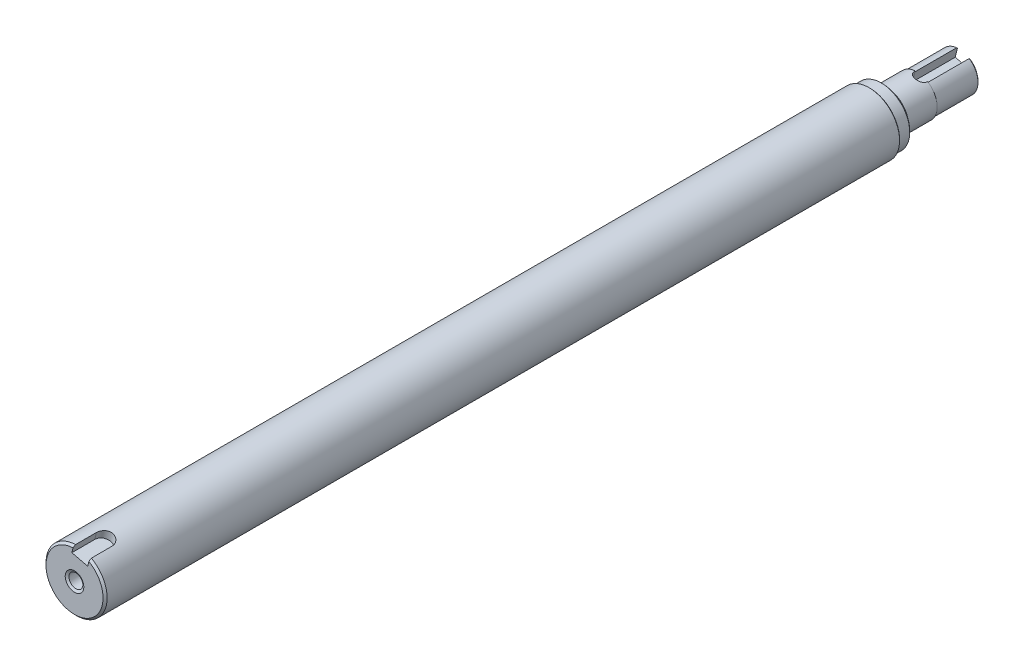
ISO-10303-21;
HEADER;
FILE_DESCRIPTION(('STEP AP214'),'2;1');
FILE_NAME('part.step','',(''),(''),'','','');
FILE_SCHEMA(('AUTOMOTIVE_DESIGN { 1 0 10303 214 1 1 1 1 }'));
ENDSEC;
DATA;
#1=APPLICATION_CONTEXT('core data for automotive mechanical design processes');
#2=APPLICATION_PROTOCOL_DEFINITION('international standard','automotive_design',2000,#1);
#3=PRODUCT_CONTEXT('',#1,'mechanical');
#4=PRODUCT('Part','Part','',(#3));
#5=PRODUCT_RELATED_PRODUCT_CATEGORY('part','',(#4));
#6=PRODUCT_DEFINITION_FORMATION('','',#4);
#7=PRODUCT_DEFINITION_CONTEXT('part definition',#1,'design');
#8=PRODUCT_DEFINITION('design','',#6,#7);
#9=PRODUCT_DEFINITION_SHAPE('','',#8);
#10=(LENGTH_UNIT() NAMED_UNIT(*) SI_UNIT(.MILLI.,.METRE.));
#11=(NAMED_UNIT(*) PLANE_ANGLE_UNIT() SI_UNIT($,.RADIAN.));
#12=(NAMED_UNIT(*) SI_UNIT($,.STERADIAN.) SOLID_ANGLE_UNIT());
#13=UNCERTAINTY_MEASURE_WITH_UNIT(LENGTH_MEASURE(1.E-05),#10,'distance_accuracy_value','');
#14=(GEOMETRIC_REPRESENTATION_CONTEXT(3) GLOBAL_UNCERTAINTY_ASSIGNED_CONTEXT((#13)) GLOBAL_UNIT_ASSIGNED_CONTEXT((#10,
#11,#12)) REPRESENTATION_CONTEXT('',''));
#15=CARTESIAN_POINT('',(0.,0.,0.));
#16=DIRECTION('',(0.,0.,1.));
#17=DIRECTION('',(1.,0.,0.));
#18=AXIS2_PLACEMENT_3D('',#15,#16,#17);
#19=CARTESIAN_POINT('',(521.923120033733,395.355248277508,-133.35));
#20=DIRECTION('',(0.,0.,1.));
#21=DIRECTION('',(1.,0.,0.));
#22=AXIS2_PLACEMENT_3D('',#19,#20,#21);
#23=PLANE('',#22);
#24=DIRECTION('',(0.234780935456974,0.972048307619507,0.));
#25=VECTOR('',#24,1.);
#26=CARTESIAN_POINT('',(475.654817898661,414.490816223619,-133.35));
#27=LINE('',#26,#25);
#28=CARTESIAN_POINT('',(474.350316326028,409.089872814408,-133.35));
#29=VERTEX_POINT('',#28);
#30=CARTESIAN_POINT('',(475.401574776672,413.442330120322,-133.350000000001));
#31=VERTEX_POINT('',#30);
#32=EDGE_CURVE('E86',#29,#31,#27,.T.);
#33=ORIENTED_EDGE('',*,*,#32,.F.);
#34=DIRECTION('',(-0.972048307619508,0.234780935456973,0.));
#35=VECTOR('',#34,1.);
#36=CARTESIAN_POINT('',(475.121879670201,408.903515446889,-133.35));
#37=LINE('',#36,#35);
#38=CARTESIAN_POINT('',(480.522823079412,407.599013874256,-133.35));
#39=VERTEX_POINT('',#38);
#40=EDGE_CURVE('E163',#39,#29,#37,.T.);
#41=ORIENTED_EDGE('',*,*,#40,.F.);
#42=DIRECTION('',(-0.234780935456974,-0.972048307619507,0.));
#43=VECTOR('',#42,1.);
#44=CARTESIAN_POINT('',(481.268252549488,410.685267250948,-133.35));
#45=LINE('',#44,#43);
#46=CARTESIAN_POINT('',(481.574081530056,411.951471180169,-133.350000000002));
#47=VERTEX_POINT('',#46);
#48=EDGE_CURVE('E156',#47,#39,#45,.T.);
#49=ORIENTED_EDGE('',*,*,#48,.F.);
#50=CARTESIAN_POINT('',(476.510652388512,404.510927831157,-133.350000000005));
#51=DIRECTION('',(0.,0.,1.));
#52=DIRECTION('',(1.,0.,0.));
#53=AXIS2_PLACEMENT_3D('',#50,#51,#52);
#54=CIRCLE('',#53,8.99999999999548);
#55=EDGE_CURVE('E20',#31,#47,#54,.T.);
#56=ORIENTED_EDGE('',*,*,#55,.F.);
#57=EDGE_LOOP('',(#33,#41,#49,#56));
#58=FACE_BOUND('',#57,.T.);
#59=ADVANCED_FACE('F17',(#58),#23,.F.);
#60=CARTESIAN_POINT('',(476.510652388512,404.510927831157,-132.85));
#61=DIRECTION('',(0.,0.,1.));
#62=DIRECTION('',(1.,0.,0.));
#63=AXIS2_PLACEMENT_3D('',#60,#61,#62);
#64=CONICAL_SURFACE('',#63,9.50000000000045,0.785398163397421);
#65=CARTESIAN_POINT('',(476.510652388512,404.510927831157,-132.85));
#66=DIRECTION('',(0.,0.,-1.));
#67=DIRECTION('',(-1.,0.,0.));
#68=AXIS2_PLACEMENT_3D('',#65,#66,#67);
#69=CIRCLE('',#68,9.5);
#70=CARTESIAN_POINT('',(475.526565350604,413.959820501826,-132.85));
#71=VERTEX_POINT('',#70);
#72=CARTESIAN_POINT('',(481.699072103988,412.468961561675,-132.85));
#73=VERTEX_POINT('',#72);
#74=EDGE_CURVE('E149',#71,#73,#69,.F.);
#75=ORIENTED_EDGE('',*,*,#74,.F.);
#76=CARTESIAN_POINT('',(475.401574776673,413.442330120325,-133.349999999998));
#77=CARTESIAN_POINT('',(475.422441813003,413.528724559936,-133.266826631975));
#78=CARTESIAN_POINT('',(475.443291212558,413.615045979145,-133.183573280381));
#79=CARTESIAN_POINT('',(475.4849547372,413.787542772972,-133.016906613708));
#80=CARTESIAN_POINT('',(475.505768862289,413.873718147596,-132.933493298636));
#81=CARTESIAN_POINT('',(475.526565350605,413.959820501826,-132.85));
#82=B_SPLINE_CURVE_WITH_KNOTS('',3,(#76,#77,#78,#79,#80,#81),.UNSPECIFIED.,.F.,.F.,(4,2,4),(0.,
0.365177831816474,0.730355647592018),.UNSPECIFIED.);
#83=EDGE_CURVE('E170',#31,#71,#82,.T.);
#84=ORIENTED_EDGE('',*,*,#83,.F.);
#85=ORIENTED_EDGE('',*,*,#55,.T.);
#86=CARTESIAN_POINT('',(481.699072103989,412.468961561675,-132.85));
#87=CARTESIAN_POINT('',(481.678275615673,412.382859207444,-132.933493298637));
#88=CARTESIAN_POINT('',(481.657461490584,412.29668383282,-133.016906613708));
#89=CARTESIAN_POINT('',(481.615797965941,412.124187038991,-133.183573280382));
#90=CARTESIAN_POINT('',(481.594948566387,412.037865619782,-133.266826631978));
#91=CARTESIAN_POINT('',(481.574081530056,411.951471180171,-133.350000000001));
#92=B_SPLINE_CURVE_WITH_KNOTS('',3,(#86,#87,#88,#89,#90,#91),.UNSPECIFIED.,.F.,.F.,(4,2,4),(0.,
0.365177815777874,0.730355647596647),.UNSPECIFIED.);
#93=EDGE_CURVE('E162',#73,#47,#92,.T.);
#94=ORIENTED_EDGE('',*,*,#93,.F.);
#95=EDGE_LOOP('',(#75,#84,#85,#94));
#96=FACE_BOUND('',#95,.T.);
#97=ADVANCED_FACE('F303',(#96),#64,.T.);
#98=CARTESIAN_POINT('',(475.654817898661,414.490816223619,-133.35));
#99=DIRECTION('',(0.972048307619507,-0.234780935456974,0.));
#100=DIRECTION('',(0.234780935456974,0.972048307619507,0.));
#101=AXIS2_PLACEMENT_3D('',#98,#99,#100);
#102=PLANE('',#101);
#103=ORIENTED_EDGE('',*,*,#83,.T.);
#104=DIRECTION('',(0.,0.,-1.));
#105=VECTOR('',#104,1.);
#106=CARTESIAN_POINT('',(475.526565350604,413.959820501826,-133.35));
#107=LINE('',#106,#105);
#108=CARTESIAN_POINT('',(475.526565350604,413.959820501826,-112.35));
#109=VERTEX_POINT('',#108);
#110=EDGE_CURVE('E145',#109,#71,#107,.T.);
#111=ORIENTED_EDGE('',*,*,#110,.F.);
#112=DIRECTION('',(0.234780935456973,0.972048307619508,0.));
#113=VECTOR('',#112,1.);
#114=CARTESIAN_POINT('',(475.095745796104,412.1761261911,-112.35));
#115=LINE('',#114,#113);
#116=CARTESIAN_POINT('',(474.350316326028,409.089872814408,-112.35));
#117=VERTEX_POINT('',#116);
#118=EDGE_CURVE('E150',#109,#117,#115,.F.);
#119=ORIENTED_EDGE('',*,*,#118,.T.);
#120=DIRECTION('',(0.,0.,1.));
#121=VECTOR('',#120,1.);
#122=CARTESIAN_POINT('',(474.350316326028,409.089872814408,-133.35));
#123=LINE('',#122,#121);
#124=EDGE_CURVE('E159',#29,#117,#123,.T.);
#125=ORIENTED_EDGE('',*,*,#124,.F.);
#126=ORIENTED_EDGE('',*,*,#32,.T.);
#127=EDGE_LOOP('',(#103,#111,#119,#125,#126));
#128=FACE_BOUND('',#127,.T.);
#129=ADVANCED_FACE('F306',(#128),#102,.T.);
#130=CARTESIAN_POINT('',(475.121879670201,408.903515446889,-133.35));
#131=DIRECTION('',(0.234780935456973,0.972048307619508,0.));
#132=DIRECTION('',(-0.972048307619508,0.234780935456973,0.));
#133=AXIS2_PLACEMENT_3D('',#130,#131,#132);
#134=PLANE('',#133);
#135=ORIENTED_EDGE('',*,*,#124,.T.);
#136=CARTESIAN_POINT('',(477.43656970272,408.344443344332,-112.35));
#137=DIRECTION('',(0.234780935456973,0.972048307619508,0.));
#138=DIRECTION('',(-0.972048307619508,0.234780935456973,0.));
#139=AXIS2_PLACEMENT_3D('',#136,#137,#138);
#140=CIRCLE('',#139,3.17499999999991);
#141=CARTESIAN_POINT('',(480.522823079412,407.599013874256,-112.35));
#142=VERTEX_POINT('',#141);
#143=EDGE_CURVE('E152',#117,#142,#140,.T.);
#144=ORIENTED_EDGE('',*,*,#143,.T.);
#145=DIRECTION('',(0.,0.,1.));
#146=VECTOR('',#145,1.);
#147=CARTESIAN_POINT('',(480.522823079412,407.599013874256,-133.35));
#148=LINE('',#147,#146);
#149=EDGE_CURVE('E146',#39,#142,#148,.T.);
#150=ORIENTED_EDGE('',*,*,#149,.F.);
#151=ORIENTED_EDGE('',*,*,#40,.T.);
#152=EDGE_LOOP('',(#135,#144,#150,#151));
#153=FACE_BOUND('',#152,.T.);
#154=ADVANCED_FACE('F292',(#153),#134,.T.);
#155=CARTESIAN_POINT('',(481.268252549488,410.685267250948,-133.35));
#156=DIRECTION('',(-0.972048307619507,0.234780935456974,0.));
#157=DIRECTION('',(-0.234780935456974,-0.972048307619507,0.));
#158=AXIS2_PLACEMENT_3D('',#155,#156,#157);
#159=PLANE('',#158);
#160=ORIENTED_EDGE('',*,*,#48,.T.);
#161=ORIENTED_EDGE('',*,*,#149,.T.);
#162=DIRECTION('',(0.234780935456973,0.972048307619508,0.));
#163=VECTOR('',#162,1.);
#164=CARTESIAN_POINT('',(481.268252549488,410.685267250948,-112.35));
#165=LINE('',#164,#163);
#166=CARTESIAN_POINT('',(481.699072103988,412.468961561675,-112.35));
#167=VERTEX_POINT('',#166);
#168=EDGE_CURVE('E141',#142,#167,#165,.T.);
#169=ORIENTED_EDGE('',*,*,#168,.T.);
#170=DIRECTION('',(0.,0.,-1.));
#171=VECTOR('',#170,1.);
#172=CARTESIAN_POINT('',(481.699072103988,412.468961561675,-133.35));
#173=LINE('',#172,#171);
#174=EDGE_CURVE('E142',#73,#167,#173,.F.);
#175=ORIENTED_EDGE('',*,*,#174,.F.);
#176=ORIENTED_EDGE('',*,*,#93,.T.);
#177=EDGE_LOOP('',(#160,#161,#169,#175,#176));
#178=FACE_BOUND('',#177,.T.);
#179=ADVANCED_FACE('F287',(#178),#159,.T.);
#180=CARTESIAN_POINT('',(476.510652388512,404.510927831157,-133.35));
#181=DIRECTION('',(0.,0.,-1.));
#182=DIRECTION('',(-1.,0.,0.));
#183=AXIS2_PLACEMENT_3D('',#180,#181,#182);
#184=CYLINDRICAL_SURFACE('',#183,9.5);
#185=ORIENTED_EDGE('',*,*,#110,.T.);
#186=ORIENTED_EDGE('',*,*,#74,.T.);
#187=ORIENTED_EDGE('',*,*,#174,.T.);
#188=CARTESIAN_POINT('',(476.510652388512,404.510927831157,-112.35));
#189=DIRECTION('',(0.,0.,-1.));
#190=DIRECTION('',(-1.,0.,0.));
#191=AXIS2_PLACEMENT_3D('',#188,#189,#190);
#192=CIRCLE('',#191,9.5);
#193=EDGE_CURVE('E137',#109,#167,#192,.F.);
#194=ORIENTED_EDGE('',*,*,#193,.F.);
#195=EDGE_LOOP('',(#185,#186,#187,#194));
#196=FACE_BOUND('',#195,.T.);
#197=ADVANCED_FACE('F283',(#196),#184,.T.);
#198=CARTESIAN_POINT('',(478.181999172796,411.430696721024,-112.35));
#199=DIRECTION('',(0.234780935456973,0.972048307619508,0.));
#200=DIRECTION('',(-0.972048307619508,0.234780935456973,0.));
#201=AXIS2_PLACEMENT_3D('',#198,#199,#200);
#202=CYLINDRICAL_SURFACE('',#201,3.17499999999991);
#203=ORIENTED_EDGE('',*,*,#143,.F.);
#204=ORIENTED_EDGE('',*,*,#118,.F.);
#205=DIRECTION('',(-0.234780935458529,-0.972048307619132,0.));
#206=VECTOR('',#205,1.);
#207=CARTESIAN_POINT('',(475.644537989007,414.448254979187,-112.35));
#208=LINE('',#207,#206);
#209=CARTESIAN_POINT('',(475.644537989007,414.448254979187,-112.35));
#210=VERTEX_POINT('',#209);
#211=EDGE_CURVE('E134',#210,#109,#208,.T.);
#212=ORIENTED_EDGE('',*,*,#211,.F.);
#213=CARTESIAN_POINT('',(481.817044742391,412.957396039035,-112.35));
#214=CARTESIAN_POINT('',(481.817052534881,412.957380734605,-112.263137361035));
#215=CARTESIAN_POINT('',(481.813860906389,412.959395992926,-112.176282092153));
#216=CARTESIAN_POINT('',(481.801140539047,412.967372887523,-112.003240209029));
#217=CARTESIAN_POINT('',(481.791613376921,412.973333541907,-111.917053433817));
#218=CARTESIAN_POINT('',(481.766318526275,412.989064876514,-111.746194402301));
#219=CARTESIAN_POINT('',(481.75056811115,412.998825009725,-111.661518626264));
#220=CARTESIAN_POINT('',(481.712954282953,413.021930359429,-111.494056650198));
#221=CARTESIAN_POINT('',(481.691090677621,413.035275688677,-111.411270509686));
#222=CARTESIAN_POINT('',(481.616552953875,413.080281019562,-111.16667784466));
#223=CARTESIAN_POINT('',(481.554896723902,413.116933198912,-111.008400706112));
#224=CARTESIAN_POINT('',(481.409166513814,413.200703860779,-110.705578708409));
#225=CARTESIAN_POINT('',(481.32508030872,413.247828048496,-110.561041396297));
#226=CARTESIAN_POINT('',(481.1331658745,413.350905811269,-110.284623214537));
#227=CARTESIAN_POINT('',(481.024661524387,413.407094456569,-110.153298321329));
#228=CARTESIAN_POINT('',(480.787756454028,413.523385627714,-109.912038589056));
#229=CARTESIAN_POINT('',(480.659352286334,413.58348883067,-109.802107463708));
#230=CARTESIAN_POINT('',(480.381990484638,413.705317898208,-109.604260680395));
#231=CARTESIAN_POINT('',(480.232619919055,413.767048633857,-109.516924662349));
#232=CARTESIAN_POINT('',(479.919291083335,413.886955452596,-109.370574235725));
#233=CARTESIAN_POINT('',(479.755336961589,413.945132538654,-109.311551803507));
#234=CARTESIAN_POINT('',(479.422716740883,414.05294443559,-109.22537572021));
#235=CARTESIAN_POINT('',(479.254368340496,414.102792716884,-109.197264507543));
#236=CARTESIAN_POINT('',(478.913085026859,414.193908073176,-109.17067190051));
#237=CARTESIAN_POINT('',(478.740151110076,414.235176995579,-109.172184120599));
#238=CARTESIAN_POINT('',(478.401228550288,414.306604904744,-109.204172852332));
#239=CARTESIAN_POINT('',(478.235212942224,414.337108790361,-109.233610307922));
#240=CARTESIAN_POINT('',(477.908634124574,414.388863945628,-109.318904685825));
#241=CARTESIAN_POINT('',(477.748071211598,414.410114712682,-109.374763042886));
#242=CARTESIAN_POINT('',(477.434888744258,414.444283684274,-109.51196562227));
#243=CARTESIAN_POINT('',(477.282393720655,414.457094299563,-109.59361999383));
#244=CARTESIAN_POINT('',(476.991613210655,414.475392626872,-109.779842734938));
#245=CARTESIAN_POINT('',(476.853331299973,414.480878500286,-109.884416849979));
#246=CARTESIAN_POINT('',(476.589062788132,414.486533470207,-110.118817937304));
#247=CARTESIAN_POINT('',(476.463862175491,414.486463417473,-110.249538504276));
#248=CARTESIAN_POINT('',(476.236667074772,414.482813208636,-110.529793028533));
#249=CARTESIAN_POINT('',(476.134679702336,414.479231978019,-110.679332732766));
#250=CARTESIAN_POINT('',(475.956271062432,414.470918746569,-110.995583585789));
#251=CARTESIAN_POINT('',(475.880185041512,414.466172930689,-111.162485885291));
#252=CARTESIAN_POINT('',(475.78899678866,414.459834244905,-111.42063029794));
#253=CARTESIAN_POINT('',(475.762426691894,414.457851622148,-111.507961685886));
#254=CARTESIAN_POINT('',(475.717168523959,414.454344198798,-111.684641398835));
#255=CARTESIAN_POINT('',(475.698476837506,414.452819188305,-111.773988778856));
#256=CARTESIAN_POINT('',(475.670773002294,414.450515676669,-111.944346246491));
#257=CARTESIAN_POINT('',(475.660937954154,414.449674670847,-112.025223221496));
#258=CARTESIAN_POINT('',(475.647820086996,414.448540914107,-112.187397306677));
#259=CARTESIAN_POINT('',(475.644528215573,414.448247405769,-112.268693680177));
#260=CARTESIAN_POINT('',(475.644537989007,414.448254979187,-112.35));
#261=B_SPLINE_CURVE_WITH_KNOTS('',3,(#213,#214,#215,#216,#217,#218,#219,#220,#221,#222,#223,
#224,#225,#226,#227,#228,#229,#230,#231,#232,#233,#234,#235,#236,#237,#238,#239,#240,#241,#242,
#243,#244,#245,#246,#247,#248,#249,#250,#251,#252,#253,#254,#255,#256,#257,#258,#259,#260),
.UNSPECIFIED.,.F.,.F.,(4,2,2,2,2,2,2,2,2,2,2,2,2,2,2,2,2,2,2,2,2,2,2,4),(0.,0.260493438209104,
0.520922071662688,0.78063287523363,1.04035184765394,1.55907864554871,2.07808874413615,
2.61377732724506,3.14955881711537,3.69796205097006,4.24620978370567,4.77694872265329,
5.30757325824494,5.81919785275494,6.33085023345286,6.84890472148184,7.36708922360146,
7.90759007302001,8.44825638173365,8.99567591755733,9.26929425791174,9.54278690183495,
9.78695849134366,10.0307920366168),.UNSPECIFIED.);
#262=CARTESIAN_POINT('',(481.81704474239,412.957396039036,-112.35));
#263=VERTEX_POINT('',#262);
#264=EDGE_CURVE('E269',#263,#210,#261,.T.);
#265=ORIENTED_EDGE('',*,*,#264,.F.);
#266=DIRECTION('',(0.234780935456675,0.972048307619579,0.));
#267=VECTOR('',#266,1.);
#268=CARTESIAN_POINT('',(481.699072103988,412.468961561675,-112.35));
#269=LINE('',#268,#267);
#270=EDGE_CURVE('E138',#167,#263,#269,.T.);
#271=ORIENTED_EDGE('',*,*,#270,.F.);
#272=ORIENTED_EDGE('',*,*,#168,.F.);
#273=EDGE_LOOP('',(#203,#204,#212,#265,#271,#272));
#274=FACE_BOUND('',#273,.T.);
#275=ADVANCED_FACE('F279',(#274),#202,.F.);
#276=CARTESIAN_POINT('',(478.572054776524,408.549876829984,-112.35));
#277=DIRECTION('',(0.,0.,-1.));
#278=DIRECTION('',(-1.,0.,0.));
#279=AXIS2_PLACEMENT_3D('',#276,#277,#278);
#280=PLANE('',#279);
#281=ORIENTED_EDGE('',*,*,#211,.T.);
#282=ORIENTED_EDGE('',*,*,#193,.T.);
#283=ORIENTED_EDGE('',*,*,#270,.T.);
#284=CARTESIAN_POINT('',(476.510652388512,404.510927831157,-112.35));
#285=DIRECTION('',(0.,0.,1.));
#286=DIRECTION('',(1.,0.,0.));
#287=AXIS2_PLACEMENT_3D('',#284,#285,#286);
#288=CIRCLE('',#287,9.975);
#289=EDGE_CURVE('E276',#210,#263,#288,.T.);
#290=ORIENTED_EDGE('',*,*,#289,.F.);
#291=EDGE_LOOP('',(#281,#282,#283,#290));
#292=FACE_BOUND('',#291,.T.);
#293=ADVANCED_FACE('F265',(#292),#280,.T.);
#294=CARTESIAN_POINT('',(476.510652388512,404.510927831157,-136.15));
#295=DIRECTION('',(0.,0.,1.));
#296=DIRECTION('',(1.,0.,0.));
#297=AXIS2_PLACEMENT_3D('',#294,#295,#296);
#298=CYLINDRICAL_SURFACE('',#297,9.975);
#299=CARTESIAN_POINT('',(476.510652388512,404.510927831157,-97.3499999999999));
#300=DIRECTION('',(0.,0.,1.));
#301=DIRECTION('',(1.,0.,0.));
#302=AXIS2_PLACEMENT_3D('',#299,#300,#301);
#303=CIRCLE('',#302,9.975);
#304=CARTESIAN_POINT('',(486.485652388512,404.510927831157,-97.3499999999999));
#305=VERTEX_POINT('',#304);
#306=EDGE_CURVE('E596',#305,#305,#303,.F.);
#307=ORIENTED_EDGE('',*,*,#306,.T.);
#308=EDGE_LOOP('',(#307));
#309=FACE_BOUND('',#308,.T.);
#310=ORIENTED_EDGE('',*,*,#289,.T.);
#311=ORIENTED_EDGE('',*,*,#264,.T.);
#312=EDGE_LOOP('',(#310,#311));
#313=FACE_BOUND('',#312,.T.);
#314=ADVANCED_FACE('F260',(#309,#313),#298,.T.);
#315=CARTESIAN_POINT('',(466.010652388512,404.510927831157,-97.3499999999999));
#316=DIRECTION('',(0.,0.,1.));
#317=DIRECTION('',(1.,0.,0.));
#318=AXIS2_PLACEMENT_3D('',#315,#316,#317);
#319=PLANE('',#318);
#320=CARTESIAN_POINT('',(476.510652388512,404.510927831157,-97.3499999999999));
#321=DIRECTION('',(0.,0.,1.));
#322=DIRECTION('',(1.,0.,0.));
#323=AXIS2_PLACEMENT_3D('',#320,#321,#322);
#324=CIRCLE('',#323,11.);
#325=CARTESIAN_POINT('',(487.510652388512,404.510927831157,-97.3499999999999));
#326=VERTEX_POINT('',#325);
#327=EDGE_CURVE('E129',#326,#326,#324,.T.);
#328=ORIENTED_EDGE('',*,*,#327,.F.);
#329=EDGE_LOOP('',(#328));
#330=FACE_BOUND('',#329,.T.);
#331=ORIENTED_EDGE('',*,*,#306,.F.);
#332=EDGE_LOOP('',(#331));
#333=FACE_BOUND('',#332,.T.);
#334=ADVANCED_FACE('F256',(#330,#333),#319,.F.);
#335=CARTESIAN_POINT('',(476.510652388512,404.510927831157,-96.3499999999999));
#336=DIRECTION('',(0.,0.,1.));
#337=DIRECTION('',(1.,0.,0.));
#338=AXIS2_PLACEMENT_3D('',#335,#336,#337);
#339=CYLINDRICAL_SURFACE('',#338,11.);
#340=CARTESIAN_POINT('',(476.510652388512,404.510927831157,-95.3499999999999));
#341=DIRECTION('',(0.,0.,1.));
#342=DIRECTION('',(1.,0.,0.));
#343=AXIS2_PLACEMENT_3D('',#340,#341,#342);
#344=CIRCLE('',#343,11.);
#345=CARTESIAN_POINT('',(487.510652388512,404.510927831157,-95.3499999999999));
#346=VERTEX_POINT('',#345);
#347=EDGE_CURVE('E123',#346,#346,#344,.F.);
#348=ORIENTED_EDGE('',*,*,#347,.T.);
#349=EDGE_LOOP('',(#348));
#350=FACE_BOUND('',#349,.T.);
#351=ORIENTED_EDGE('',*,*,#327,.T.);
#352=EDGE_LOOP('',(#351));
#353=FACE_BOUND('',#352,.T.);
#354=ADVANCED_FACE('F116',(#350,#353),#339,.T.);
#355=CARTESIAN_POINT('',(476.510652388512,404.510927831157,277.550000000019));
#356=DIRECTION('',(0.,0.,1.));
#357=DIRECTION('',(1.,0.,0.));
#358=AXIS2_PLACEMENT_3D('',#355,#356,#357);
#359=CONICAL_SURFACE('',#358,3.39999999998469,1.02974425867119);
#360=CARTESIAN_POINT('',(476.510652388441,404.510927831157,275.507073895341));
#361=VERTEX_POINT('',#360);
#362=VERTEX_LOOP('',#361);
#363=FACE_BOUND('',#362,.T.);
#364=CARTESIAN_POINT('',(476.510652388512,404.510927831157,277.55));
#365=DIRECTION('',(0.,0.,1.));
#366=DIRECTION('',(1.,0.,0.));
#367=AXIS2_PLACEMENT_3D('',#364,#365,#366);
#368=CIRCLE('',#367,3.4);
#369=CARTESIAN_POINT('',(479.910652388512,404.510927831157,277.55));
#370=VERTEX_POINT('',#369);
#371=EDGE_CURVE('E120',#370,#370,#368,.T.);
#372=ORIENTED_EDGE('',*,*,#371,.T.);
#373=EDGE_LOOP('',(#372));
#374=FACE_BOUND('',#373,.T.);
#375=ADVANCED_FACE('F112',(#363,#374),#359,.F.);
#376=CARTESIAN_POINT('',(464.010652388512,404.510927831157,-95.3499999999999));
#377=DIRECTION('',(0.,0.,1.));
#378=DIRECTION('',(1.,0.,0.));
#379=AXIS2_PLACEMENT_3D('',#376,#377,#378);
#380=PLANE('',#379);
#381=CARTESIAN_POINT('',(476.510652388512,404.510927831157,-95.3499999999999));
#382=DIRECTION('',(0.,0.,1.));
#383=DIRECTION('',(0.,-1.,0.));
#384=AXIS2_PLACEMENT_3D('',#381,#382,#383);
#385=CIRCLE('',#384,13.5);
#386=CARTESIAN_POINT('',(476.510652388512,391.010927831157,-95.3499999999999));
#387=VERTEX_POINT('',#386);
#388=EDGE_CURVE('E122',#387,#387,#385,.T.);
#389=ORIENTED_EDGE('',*,*,#388,.F.);
#390=EDGE_LOOP('',(#389));
#391=FACE_BOUND('',#390,.T.);
#392=ORIENTED_EDGE('',*,*,#347,.F.);
#393=EDGE_LOOP('',(#392));
#394=FACE_BOUND('',#393,.T.);
#395=ADVANCED_FACE('F115',(#391,#394),#380,.F.);
#396=CARTESIAN_POINT('',(476.510652388512,404.510927831157,-94.8499999999999));
#397=DIRECTION('',(0.,0.,1.));
#398=DIRECTION('',(0.,-1.,0.));
#399=AXIS2_PLACEMENT_3D('',#396,#397,#398);
#400=CONICAL_SURFACE('',#399,14.,0.785398163397462);
#401=ORIENTED_EDGE('',*,*,#388,.T.);
#402=EDGE_LOOP('',(#401));
#403=FACE_BOUND('',#402,.T.);
#404=CARTESIAN_POINT('',(476.510652388512,404.510927831157,-94.8499999999999));
#405=DIRECTION('',(0.,0.,1.));
#406=DIRECTION('',(1.,0.,0.));
#407=AXIS2_PLACEMENT_3D('',#404,#405,#406);
#408=CIRCLE('',#407,14.);
#409=CARTESIAN_POINT('',(490.510652388512,404.510927831157,-94.8499999999999));
#410=VERTEX_POINT('',#409);
#411=EDGE_CURVE('E126',#410,#410,#408,.T.);
#412=ORIENTED_EDGE('',*,*,#411,.F.);
#413=EDGE_LOOP('',(#412));
#414=FACE_BOUND('',#413,.T.);
#415=ADVANCED_FACE('F247',(#403,#414),#400,.T.);
#416=CARTESIAN_POINT('',(476.510652388512,404.510927831157,301.05));
#417=DIRECTION('',(0.,0.,1.));
#418=DIRECTION('',(1.,0.,0.));
#419=AXIS2_PLACEMENT_3D('',#416,#417,#418);
#420=CYLINDRICAL_SURFACE('',#419,3.4);
#421=ORIENTED_EDGE('',*,*,#371,.F.);
#422=EDGE_LOOP('',(#421));
#423=FACE_BOUND('',#422,.T.);
#424=CARTESIAN_POINT('',(476.510652388512,404.510927831157,300.37883031207));
#425=DIRECTION('',(0.,0.,1.));
#426=DIRECTION('',(-1.,0.,0.));
#427=AXIS2_PLACEMENT_3D('',#424,#425,#426);
#428=CIRCLE('',#427,3.40000000004154);
#429=CARTESIAN_POINT('',(473.11065238847,404.510927831157,300.37883031207));
#430=VERTEX_POINT('',#429);
#431=EDGE_CURVE('E523',#430,#430,#428,.T.);
#432=ORIENTED_EDGE('',*,*,#431,.T.);
#433=EDGE_LOOP('',(#432));
#434=FACE_BOUND('',#433,.T.);
#435=ADVANCED_FACE('F243',(#423,#434),#420,.F.);
#436=CARTESIAN_POINT('',(476.510652388512,404.510927831157,-92.8499999999999));
#437=DIRECTION('',(0.,0.,1.));
#438=DIRECTION('',(1.,0.,0.));
#439=AXIS2_PLACEMENT_3D('',#436,#437,#438);
#440=CYLINDRICAL_SURFACE('',#439,14.);
#441=CARTESIAN_POINT('',(476.510652388512,404.510927831157,-89.3499999999999));
#442=DIRECTION('',(0.,0.,1.));
#443=DIRECTION('',(1.,0.,0.));
#444=AXIS2_PLACEMENT_3D('',#441,#442,#443);
#445=CIRCLE('',#444,14.);
#446=CARTESIAN_POINT('',(490.510652388512,404.510927831157,-89.3499999999999));
#447=VERTEX_POINT('',#446);
#448=EDGE_CURVE('E223',#447,#447,#445,.F.);
#449=ORIENTED_EDGE('',*,*,#448,.T.);
#450=EDGE_LOOP('',(#449));
#451=FACE_BOUND('',#450,.T.);
#452=ORIENTED_EDGE('',*,*,#411,.T.);
#453=EDGE_LOOP('',(#452));
#454=FACE_BOUND('',#453,.T.);
#455=ADVANCED_FACE('F239',(#451,#454),#440,.T.);
#456=CARTESIAN_POINT('',(476.510652388512,404.510927831157,301.050000000032));
#457=DIRECTION('',(0.,0.,1.));
#458=DIRECTION('',(1.,0.,0.));
#459=AXIS2_PLACEMENT_3D('',#456,#457,#458);
#460=CONICAL_SURFACE('',#459,4.56250000006236,1.04719755117994);
#461=CARTESIAN_POINT('',(476.510652388512,404.510927831157,301.049999999975));
#462=DIRECTION('',(0.,0.,1.));
#463=DIRECTION('',(1.,0.,0.));
#464=AXIS2_PLACEMENT_3D('',#461,#462,#463);
#465=CIRCLE('',#464,4.56249999996317);
#466=CARTESIAN_POINT('',(481.073152388475,404.510927831157,301.049999999975));
#467=VERTEX_POINT('',#466);
#468=EDGE_CURVE('E538',#467,#467,#465,.F.);
#469=ORIENTED_EDGE('',*,*,#468,.F.);
#470=EDGE_LOOP('',(#469));
#471=FACE_BOUND('',#470,.T.);
#472=ORIENTED_EDGE('',*,*,#431,.F.);
#473=EDGE_LOOP('',(#472));
#474=FACE_BOUND('',#473,.T.);
#475=ADVANCED_FACE('F236',(#471,#474),#460,.F.);
#476=CARTESIAN_POINT('',(479.093242774892,415.203459613899,301.05));
#477=DIRECTION('',(0.234780935456973,0.972048307619508,0.));
#478=DIRECTION('',(-0.972048307619508,0.234780935456973,0.));
#479=AXIS2_PLACEMENT_3D('',#476,#477,#478);
#480=PLANE('',#479);
#481=CARTESIAN_POINT('',(479.093242774892,415.203459613899,289.8));
#482=DIRECTION('',(-0.234780935456973,-0.972048307619508,0.));
#483=DIRECTION('',(0.972048307619508,-0.234780935456973,0.));
#484=AXIS2_PLACEMENT_3D('',#481,#482,#483);
#485=CIRCLE('',#484,4.);
#486=CARTESIAN_POINT('',(482.98143600537,414.264335872071,289.8));
#487=VERTEX_POINT('',#486);
#488=CARTESIAN_POINT('',(475.205049544414,416.142583355727,289.8));
#489=VERTEX_POINT('',#488);
#490=EDGE_CURVE('E222',#487,#489,#485,.F.);
#491=ORIENTED_EDGE('',*,*,#490,.T.);
#492=DIRECTION('',(0.,0.,1.));
#493=VECTOR('',#492,1.);
#494=CARTESIAN_POINT('',(475.205049544414,416.142583355727,349.05));
#495=LINE('',#494,#493);
#496=CARTESIAN_POINT('',(475.205049544414,416.142583355727,301.05));
#497=VERTEX_POINT('',#496);
#498=EDGE_CURVE('E106',#489,#497,#495,.T.);
#499=ORIENTED_EDGE('',*,*,#498,.T.);
#500=DIRECTION('',(-0.972048307619501,0.234780935457,0.));
#501=VECTOR('',#500,1.);
#502=CARTESIAN_POINT('',(482.98143600537,414.264335872071,301.05));
#503=LINE('',#502,#501);
#504=CARTESIAN_POINT('',(482.98143600537,414.264335872071,301.05));
#505=VERTEX_POINT('',#504);
#506=EDGE_CURVE('E512',#505,#497,#503,.T.);
#507=ORIENTED_EDGE('',*,*,#506,.F.);
#508=DIRECTION('',(0.,0.,1.));
#509=VECTOR('',#508,1.);
#510=CARTESIAN_POINT('',(482.98143600537,414.264335872071,349.05));
#511=LINE('',#510,#509);
#512=EDGE_CURVE('E519',#487,#505,#511,.T.);
#513=ORIENTED_EDGE('',*,*,#512,.F.);
#514=EDGE_LOOP('',(#491,#499,#507,#513));
#515=FACE_BOUND('',#514,.T.);
#516=ADVANCED_FACE('F232',(#515),#480,.T.);
#517=CARTESIAN_POINT('',(462.010652388512,404.510927831157,-89.3499999999999));
#518=DIRECTION('',(0.,0.,1.));
#519=DIRECTION('',(1.,0.,0.));
#520=AXIS2_PLACEMENT_3D('',#517,#518,#519);
#521=PLANE('',#520);
#522=CARTESIAN_POINT('',(476.510652388511,404.510927831157,-89.3499999999999));
#523=DIRECTION('',(0.,0.,1.));
#524=DIRECTION('',(1.,0.,0.));
#525=AXIS2_PLACEMENT_3D('',#522,#523,#524);
#526=CIRCLE('',#525,14.5);
#527=CARTESIAN_POINT('',(491.010652388511,404.510927831157,-89.3499999999999));
#528=VERTEX_POINT('',#527);
#529=EDGE_CURVE('E191',#528,#528,#526,.T.);
#530=ORIENTED_EDGE('',*,*,#529,.F.);
#531=EDGE_LOOP('',(#530));
#532=FACE_BOUND('',#531,.T.);
#533=ORIENTED_EDGE('',*,*,#448,.F.);
#534=EDGE_LOOP('',(#533));
#535=FACE_BOUND('',#534,.T.);
#536=ADVANCED_FACE('F228',(#532,#535),#521,.F.);
#537=CARTESIAN_POINT('',(478.844153947643,431.209331724902,349.05));
#538=DIRECTION('',(-0.972048307619508,0.234780935456973,0.));
#539=DIRECTION('',(-0.234780935456973,-0.972048307619508,0.));
#540=AXIS2_PLACEMENT_3D('',#537,#538,#539);
#541=PLANE('',#540);
#542=DIRECTION('',(0.,0.,1.));
#543=VECTOR('',#542,1.);
#544=CARTESIAN_POINT('',(476.016647767951,419.502790938685,-88.9499999999999));
#545=LINE('',#544,#543);
#546=CARTESIAN_POINT('',(476.016647767951,419.502790938685,300.05));
#547=VERTEX_POINT('',#546);
#548=CARTESIAN_POINT('',(476.016647767951,419.502790938685,289.8));
#549=VERTEX_POINT('',#548);
#550=EDGE_CURVE('E190',#547,#549,#545,.F.);
#551=ORIENTED_EDGE('',*,*,#550,.F.);
#552=CARTESIAN_POINT('',(475.77237594705,418.49144813249,301.05));
#553=CARTESIAN_POINT('',(475.813143522097,418.660235484211,300.883579738666));
#554=CARTESIAN_POINT('',(475.85388329505,418.828907728719,300.717036273213));
#555=CARTESIAN_POINT('',(475.935307235348,419.166021997443,300.383702939871));
#556=CARTESIAN_POINT('',(475.975991402696,419.334464021666,300.216913071991));
#557=CARTESIAN_POINT('',(476.016647767951,419.502790938685,300.05));
#558=B_SPLINE_CURVE_WITH_KNOTS('',3,(#552,#553,#554,#555,#556,#557),.UNSPECIFIED.,.F.,.F.,(4,2,
4),(0.,0.721540733067441,1.44308144101344),.UNSPECIFIED.);
#559=CARTESIAN_POINT('',(475.77237594705,418.49144813249,301.05));
#560=VERTEX_POINT('',#559);
#561=EDGE_CURVE('E216',#560,#547,#558,.T.);
#562=ORIENTED_EDGE('',*,*,#561,.F.);
#563=DIRECTION('',(0.234780935456913,0.972048307619522,0.));
#564=VECTOR('',#563,1.);
#565=CARTESIAN_POINT('',(475.205049544414,416.142583355727,301.05));
#566=LINE('',#565,#564);
#567=EDGE_CURVE('E515',#497,#560,#566,.T.);
#568=ORIENTED_EDGE('',*,*,#567,.F.);
#569=ORIENTED_EDGE('',*,*,#498,.F.);
#570=DIRECTION('',(-0.234780935456973,-0.972048307619508,0.));
#571=VECTOR('',#570,1.);
#572=CARTESIAN_POINT('',(472.622459158033,405.450051572985,289.8));
#573=LINE('',#572,#571);
#574=EDGE_CURVE('E221',#489,#549,#573,.F.);
#575=ORIENTED_EDGE('',*,*,#574,.T.);
#576=EDGE_LOOP('',(#551,#562,#568,#569,#575));
#577=FACE_BOUND('',#576,.T.);
#578=ADVANCED_FACE('F224',(#577),#541,.F.);
#579=CARTESIAN_POINT('',(476.510652388511,404.510927831157,289.8));
#580=DIRECTION('',(-0.234780935456973,-0.972048307619508,0.));
#581=DIRECTION('',(0.972048307619508,-0.234780935456973,0.));
#582=AXIS2_PLACEMENT_3D('',#579,#580,#581);
#583=CYLINDRICAL_SURFACE('',#582,4.);
#584=CARTESIAN_POINT('',(476.016647767951,419.502790938685,289.8));
#585=CARTESIAN_POINT('',(476.016631914386,419.502781074588,289.6896418119));
#586=CARTESIAN_POINT('',(476.021383610062,419.502946759418,289.579291588656));
#587=CARTESIAN_POINT('',(476.040299998477,419.503557095511,289.359421565445));
#588=CARTESIAN_POINT('',(476.054462943061,419.504001694963,289.249901615076));
#589=CARTESIAN_POINT('',(476.092039405398,419.505096601389,289.032698614721));
#590=CARTESIAN_POINT('',(476.115432984719,419.505746464388,288.925012123969));
#591=CARTESIAN_POINT('',(476.171217420059,419.507112564947,288.712025242798));
#592=CARTESIAN_POINT('',(476.20360843393,419.50782880367,288.606724894276));
#593=CARTESIAN_POINT('',(476.313849944936,419.509819255175,288.295533039096));
#594=CARTESIAN_POINT('',(476.404809692872,419.510937052346,288.094118186089));
#595=CARTESIAN_POINT('',(476.61842300681,419.510918547295,287.708972925096));
#596=CARTESIAN_POINT('',(476.741085961503,419.509781576671,287.525247777956));
#597=CARTESIAN_POINT('',(477.017355344971,419.503016672704,287.176046634594));
#598=CARTESIAN_POINT('',(477.171592240762,419.497288907555,287.011070441054));
#599=CARTESIAN_POINT('',(477.504635799968,419.47888579218,286.70846910214));
#600=CARTESIAN_POINT('',(477.683451200186,419.466207966639,286.57085372533));
#601=CARTESIAN_POINT('',(478.063557206399,419.431566900732,286.324766863194));
#602=CARTESIAN_POINT('',(478.265168655433,419.409454605739,286.2168110477));
#603=CARTESIAN_POINT('',(478.68219563089,419.354392537007,286.036552409691));
#604=CARTESIAN_POINT('',(478.897594185039,419.3214558893,285.964206669099));
#605=CARTESIAN_POINT('',(479.267265918711,419.256253936387,285.874102463343));
#606=CARTESIAN_POINT('',(479.419706508219,419.226967961582,285.84636352257));
#607=CARTESIAN_POINT('',(479.72572871682,419.163153333157,285.809309076677));
#608=CARTESIAN_POINT('',(479.879310312051,419.128624788887,285.799993187347));
#609=CARTESIAN_POINT('',(480.246623981497,419.03989623512,285.80000953678));
#610=CARTESIAN_POINT('',(480.45985179005,418.983351116794,285.818287989712));
#611=CARTESIAN_POINT('',(480.878016141204,418.862709262055,285.890816679773));
#612=CARTESIAN_POINT('',(481.082944744257,418.798605513623,285.94510053787));
#613=CARTESIAN_POINT('',(481.478617428173,418.665885203767,286.087746164007));
#614=CARTESIAN_POINT('',(481.669382019058,418.597275449879,286.176057464058));
#615=CARTESIAN_POINT('',(482.03244885511,418.458958434363,286.384083040174));
#616=CARTESIAN_POINT('',(482.204751182604,418.389251177632,286.503797176198));
#617=CARTESIAN_POINT('',(482.53051078064,418.251134892411,286.774163375424));
#618=CARTESIAN_POINT('',(482.683500095143,418.182783256763,286.925408584444));
#619=CARTESIAN_POINT('',(482.963021424201,418.053111103203,287.253289930516));
#620=CARTESIAN_POINT('',(483.089548760853,417.991791829322,287.429930547625));
#621=CARTESIAN_POINT('',(483.315258314691,417.879307264915,287.807348861894));
#622=CARTESIAN_POINT('',(483.413924468874,417.828337973696,288.00849416884));
#623=CARTESIAN_POINT('',(483.578363657833,417.741806223893,288.426834501681));
#624=CARTESIAN_POINT('',(483.644162730795,417.706231572258,288.644016665663));
#625=CARTESIAN_POINT('',(483.725947965432,417.661630301825,289.018611270149));
#626=CARTESIAN_POINT('',(483.751070961933,417.647783501055,289.173527441284));
#627=CARTESIAN_POINT('',(483.784622306498,417.629215029661,289.485599999269));
#628=CARTESIAN_POINT('',(483.793060520445,417.624487966481,289.642755006861));
#629=CARTESIAN_POINT('',(483.793034228907,417.624543455029,289.8));
#630=B_SPLINE_CURVE_WITH_KNOTS('',3,(#584,#585,#586,#587,#588,#589,#590,#591,#592,#593,#594,
#595,#596,#597,#598,#599,#600,#601,#602,#603,#604,#605,#606,#607,#608,#609,#610,#611,#612,#613,
#614,#615,#616,#617,#618,#619,#620,#621,#622,#623,#624,#625,#626,#627,#628,#629),.UNSPECIFIED.,
.F.,.F.,(4,2,2,2,2,2,2,2,2,2,2,2,2,2,2,2,2,2,2,2,2,2,4),(0.,0.330958505034381,0.661855551220093,
0.992041729097177,1.32223370011404,1.98191826873151,2.64179842277408,3.31643087095955,
3.99130375063909,4.67725851959024,5.36238452345503,5.83435156357469,6.30630876079984,
6.96698411148035,7.62827725482654,8.28859334962562,8.94890649979824,9.62299055044438,
10.2971936639444,10.9831693222403,11.6686006667908,12.1401499051501,12.6114202281109),.UNSPECIFIED.);
#631=CARTESIAN_POINT('',(483.793034228907,417.624543455029,289.8));
#632=VERTEX_POINT('',#631);
#633=EDGE_CURVE('E99',#549,#632,#630,.T.);
#634=ORIENTED_EDGE('',*,*,#633,.F.);
#635=ORIENTED_EDGE('',*,*,#574,.F.);
#636=ORIENTED_EDGE('',*,*,#490,.F.);
#637=DIRECTION('',(-0.234780935456973,-0.972048307619508,0.));
#638=VECTOR('',#637,1.);
#639=CARTESIAN_POINT('',(486.620540408599,429.331084241246,289.8));
#640=LINE('',#639,#638);
#641=EDGE_CURVE('E521',#632,#487,#640,.T.);
#642=ORIENTED_EDGE('',*,*,#641,.F.);
#643=EDGE_LOOP('',(#634,#635,#636,#642));
#644=FACE_BOUND('',#643,.T.);
#645=ADVANCED_FACE('F193',(#644),#583,.F.);
#646=CARTESIAN_POINT('',(486.620540408599,429.331084241246,349.05));
#647=DIRECTION('',(-0.972048307619508,0.234780935456973,0.));
#648=DIRECTION('',(-0.234780935456973,-0.972048307619508,0.));
#649=AXIS2_PLACEMENT_3D('',#646,#647,#648);
#650=PLANE('',#649);
#651=CARTESIAN_POINT('',(483.548762408006,416.613200648835,301.05));
#652=CARTESIAN_POINT('',(483.589529983053,416.781988000555,300.883579738666));
#653=CARTESIAN_POINT('',(483.630269756006,416.950660245063,300.717036273213));
#654=CARTESIAN_POINT('',(483.711693696304,417.287774513787,300.383702939871));
#655=CARTESIAN_POINT('',(483.752377863652,417.45621653801,300.216913071991));
#656=CARTESIAN_POINT('',(483.793034228907,417.624543455029,300.05));
#657=B_SPLINE_CURVE_WITH_KNOTS('',3,(#651,#652,#653,#654,#655,#656),.UNSPECIFIED.,.F.,.F.,(4,2,
4),(0.,0.721540733067122,1.44308144101281),.UNSPECIFIED.);
#658=CARTESIAN_POINT('',(483.548762408006,416.613200648835,301.05));
#659=VERTEX_POINT('',#658);
#660=CARTESIAN_POINT('',(483.793034228907,417.62454345503,300.05));
#661=VERTEX_POINT('',#660);
#662=EDGE_CURVE('E210',#659,#661,#657,.T.);
#663=ORIENTED_EDGE('',*,*,#662,.T.);
#664=DIRECTION('',(0.,0.,1.));
#665=VECTOR('',#664,1.);
#666=CARTESIAN_POINT('',(483.793034228907,417.62454345503,-88.9499999999999));
#667=LINE('',#666,#665);
#668=EDGE_CURVE('E183',#632,#661,#667,.T.);
#669=ORIENTED_EDGE('',*,*,#668,.F.);
#670=ORIENTED_EDGE('',*,*,#641,.T.);
#671=ORIENTED_EDGE('',*,*,#512,.T.);
#672=DIRECTION('',(-0.234780935456797,-0.97204830761955,0.));
#673=VECTOR('',#672,1.);
#674=CARTESIAN_POINT('',(483.548762408006,416.613200648835,301.05));
#675=LINE('',#674,#673);
#676=EDGE_CURVE('E516',#659,#505,#675,.T.);
#677=ORIENTED_EDGE('',*,*,#676,.F.);
#678=EDGE_LOOP('',(#663,#669,#670,#671,#677));
#679=FACE_BOUND('',#678,.T.);
#680=ADVANCED_FACE('F458',(#679),#650,.T.);
#681=CARTESIAN_POINT('',(480.648152388511,404.510927831157,301.05));
#682=DIRECTION('',(0.,0.,1.));
#683=DIRECTION('',(1.,0.,0.));
#684=AXIS2_PLACEMENT_3D('',#681,#682,#683);
#685=PLANE('',#684);
#686=ORIENTED_EDGE('',*,*,#506,.T.);
#687=ORIENTED_EDGE('',*,*,#567,.T.);
#688=CARTESIAN_POINT('',(476.510652388511,404.510927831157,301.05));
#689=DIRECTION('',(0.,0.,-1.));
#690=DIRECTION('',(-1.,0.,0.));
#691=AXIS2_PLACEMENT_3D('',#688,#689,#690);
#692=CIRCLE('',#691,14.0000000000004);
#693=EDGE_CURVE('E180',#659,#560,#692,.T.);
#694=ORIENTED_EDGE('',*,*,#693,.F.);
#695=ORIENTED_EDGE('',*,*,#676,.T.);
#696=EDGE_LOOP('',(#686,#687,#694,#695));
#697=FACE_BOUND('',#696,.T.);
#698=ORIENTED_EDGE('',*,*,#468,.T.);
#699=EDGE_LOOP('',(#698));
#700=FACE_BOUND('',#699,.T.);
#701=ADVANCED_FACE('F466',(#697,#700),#685,.T.);
#702=CARTESIAN_POINT('',(476.510652388511,404.510927831157,-88.85));
#703=DIRECTION('',(0.,0.,1.));
#704=DIRECTION('',(1.,0.,0.));
#705=AXIS2_PLACEMENT_3D('',#702,#703,#704);
#706=CONICAL_SURFACE('',#705,15.,0.785398163397448);
#707=ORIENTED_EDGE('',*,*,#529,.T.);
#708=EDGE_LOOP('',(#707));
#709=FACE_BOUND('',#708,.T.);
#710=CARTESIAN_POINT('',(476.510652388511,404.510927831157,-88.8499999999999));
#711=DIRECTION('',(0.,0.,1.));
#712=DIRECTION('',(1.,0.,0.));
#713=AXIS2_PLACEMENT_3D('',#710,#711,#712);
#714=CIRCLE('',#713,15.);
#715=CARTESIAN_POINT('',(491.510652388511,404.510927831157,-88.8499999999999));
#716=VERTEX_POINT('',#715);
#717=EDGE_CURVE('E26',#716,#716,#714,.T.);
#718=ORIENTED_EDGE('',*,*,#717,.F.);
#719=EDGE_LOOP('',(#718));
#720=FACE_BOUND('',#719,.T.);
#721=ADVANCED_FACE('F206',(#709,#720),#706,.T.);
#722=CARTESIAN_POINT('',(476.510652388511,404.510927831157,300.05));
#723=DIRECTION('',(0.,0.,-1.));
#724=DIRECTION('',(-1.,0.,0.));
#725=AXIS2_PLACEMENT_3D('',#722,#723,#724);
#726=CONICAL_SURFACE('',#725,15.0000000000004,0.785398163397448);
#727=CARTESIAN_POINT('',(476.510652388511,404.510927831157,300.05));
#728=DIRECTION('',(0.,0.,1.));
#729=DIRECTION('',(1.,0.,0.));
#730=AXIS2_PLACEMENT_3D('',#727,#728,#729);
#731=CIRCLE('',#730,15.);
#732=EDGE_CURVE('E11',#661,#547,#731,.F.);
#733=ORIENTED_EDGE('',*,*,#732,.F.);
#734=ORIENTED_EDGE('',*,*,#662,.F.);
#735=ORIENTED_EDGE('',*,*,#693,.T.);
#736=ORIENTED_EDGE('',*,*,#561,.T.);
#737=EDGE_LOOP('',(#733,#734,#735,#736));
#738=FACE_BOUND('',#737,.T.);
#739=ADVANCED_FACE('F201',(#738),#726,.T.);
#740=CARTESIAN_POINT('',(476.510652388511,404.510927831157,-88.9499999999999));
#741=DIRECTION('',(0.,0.,1.));
#742=DIRECTION('',(1.,0.,0.));
#743=AXIS2_PLACEMENT_3D('',#740,#741,#742);
#744=CYLINDRICAL_SURFACE('',#743,15.);
#745=ORIENTED_EDGE('',*,*,#717,.T.);
#746=EDGE_LOOP('',(#745));
#747=FACE_BOUND('',#746,.T.);
#748=ORIENTED_EDGE('',*,*,#732,.T.);
#749=ORIENTED_EDGE('',*,*,#550,.T.);
#750=ORIENTED_EDGE('',*,*,#633,.T.);
#751=ORIENTED_EDGE('',*,*,#668,.T.);
#752=EDGE_LOOP('',(#748,#749,#750,#751));
#753=FACE_BOUND('',#752,.T.);
#754=ADVANCED_FACE('F197',(#747,#753),#744,.T.);
#755=CLOSED_SHELL('',(#59,#97,#129,#154,#179,#197,#275,#293,#314,#334,#354,#375,#395,#415,#435,
#455,#475,#516,#536,#578,#645,#680,#701,#721,#739,#754));
#756=MANIFOLD_SOLID_BREP('B1',#755);
#757=ADVANCED_BREP_SHAPE_REPRESENTATION('',(#18,#756),#14);
#758=SHAPE_DEFINITION_REPRESENTATION(#9,#757);
ENDSEC;
END-ISO-10303-21;
